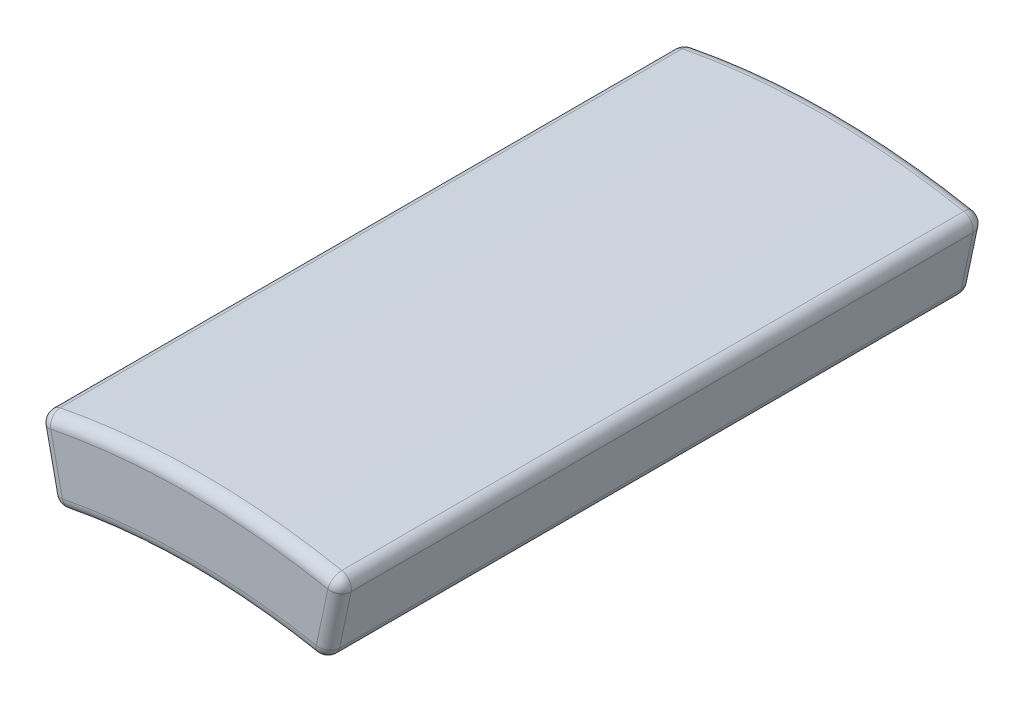
ISO-10303-21;
HEADER;
FILE_DESCRIPTION(('STEP AP214'),'2;1');
FILE_NAME('part.step','',(''),(''),'','','');
FILE_SCHEMA(('AUTOMOTIVE_DESIGN { 1 0 10303 214 1 1 1 1 }'));
ENDSEC;
DATA;
#1=APPLICATION_CONTEXT('core data for automotive mechanical design processes');
#2=APPLICATION_PROTOCOL_DEFINITION('international standard','automotive_design',2000,#1);
#3=PRODUCT_CONTEXT('',#1,'mechanical');
#4=PRODUCT('Part','Part','',(#3));
#5=PRODUCT_RELATED_PRODUCT_CATEGORY('part','',(#4));
#6=PRODUCT_DEFINITION_FORMATION('','',#4);
#7=PRODUCT_DEFINITION_CONTEXT('part definition',#1,'design');
#8=PRODUCT_DEFINITION('design','',#6,#7);
#9=PRODUCT_DEFINITION_SHAPE('','',#8);
#10=(LENGTH_UNIT() NAMED_UNIT(*) SI_UNIT(.MILLI.,.METRE.));
#11=(NAMED_UNIT(*) PLANE_ANGLE_UNIT() SI_UNIT($,.RADIAN.));
#12=(NAMED_UNIT(*) SI_UNIT($,.STERADIAN.) SOLID_ANGLE_UNIT());
#13=UNCERTAINTY_MEASURE_WITH_UNIT(LENGTH_MEASURE(1.E-05),#10,'distance_accuracy_value','');
#14=(GEOMETRIC_REPRESENTATION_CONTEXT(3) GLOBAL_UNCERTAINTY_ASSIGNED_CONTEXT((#13)) GLOBAL_UNIT_ASSIGNED_CONTEXT((#10,
#11,#12)) REPRESENTATION_CONTEXT('',''));
#15=CARTESIAN_POINT('',(0.,0.,0.));
#16=DIRECTION('',(0.,0.,1.));
#17=DIRECTION('',(1.,0.,0.));
#18=AXIS2_PLACEMENT_3D('',#15,#16,#17);
#19=CARTESIAN_POINT('',(0.,-23.65,11.));
#20=DIRECTION('',(0.,0.,-1.));
#21=DIRECTION('',(-1.,0.,0.));
#22=AXIS2_PLACEMENT_3D('',#19,#20,#21);
#23=CYLINDRICAL_SURFACE('',#22,22.3);
#24=DIRECTION('',(0.,0.,-1.));
#25=VECTOR('',#24,1.);
#26=CARTESIAN_POINT('',(4.25134622457351,-1.75899601939636,11.));
#27=LINE('',#26,#25);
#28=CARTESIAN_POINT('',(4.25134622457351,-1.75899601939636,-10.6));
#29=VERTEX_POINT('',#28);
#30=CARTESIAN_POINT('',(4.25134622457351,-1.75899601939636,10.6));
#31=VERTEX_POINT('',#30);
#32=EDGE_CURVE('E140',#29,#31,#27,.F.);
#33=ORIENTED_EDGE('',*,*,#32,.T.);
#34=CARTESIAN_POINT('',(0.,-23.65,10.6));
#35=DIRECTION('',(0.,0.,-1.));
#36=DIRECTION('',(-1.,0.,0.));
#37=AXIS2_PLACEMENT_3D('',#34,#35,#36);
#38=CIRCLE('',#37,22.3);
#39=CARTESIAN_POINT('',(-4.25134622457353,-1.75899601939636,10.6));
#40=VERTEX_POINT('',#39);
#41=EDGE_CURVE('E177',#31,#40,#38,.F.);
#42=ORIENTED_EDGE('',*,*,#41,.T.);
#43=DIRECTION('',(0.,0.,-1.));
#44=VECTOR('',#43,1.);
#45=CARTESIAN_POINT('',(-4.25134622457353,-1.75899601939636,11.));
#46=LINE('',#45,#44);
#47=CARTESIAN_POINT('',(-4.25134622457353,-1.75899601939636,-10.6));
#48=VERTEX_POINT('',#47);
#49=EDGE_CURVE('E174',#40,#48,#46,.T.);
#50=ORIENTED_EDGE('',*,*,#49,.T.);
#51=CARTESIAN_POINT('',(0.,-23.65,-10.6));
#52=DIRECTION('',(0.,0.,-1.));
#53=DIRECTION('',(-1.,0.,0.));
#54=AXIS2_PLACEMENT_3D('',#51,#52,#53);
#55=CIRCLE('',#54,22.3);
#56=EDGE_CURVE('E169',#48,#29,#55,.T.);
#57=ORIENTED_EDGE('',*,*,#56,.T.);
#58=EDGE_LOOP('',(#33,#42,#50,#57));
#59=FACE_BOUND('',#58,.T.);
#60=ADVANCED_FACE('F44',(#59),#23,.F.);
#61=CARTESIAN_POINT('',(4.63643070523595,-1.83730850363612,11.));
#62=DIRECTION('',(-0.978147600733806,0.207911690817756,0.));
#63=DIRECTION('',(-0.207911690817756,-0.978147600733806,0.));
#64=AXIS2_PLACEMENT_3D('',#61,#62,#63);
#65=PLANE('',#64);
#66=DIRECTION('',(0.,0.,-1.));
#67=VECTOR('',#66,1.);
#68=CARTESIAN_POINT('',(5.11395141383963,0.409249799960251,11.));
#69=LINE('',#68,#67);
#70=CARTESIAN_POINT('',(5.11395141383963,0.409249799960251,-10.6));
#71=VERTEX_POINT('',#70);
#72=CARTESIAN_POINT('',(5.11395141383963,0.409249799960251,10.6));
#73=VERTEX_POINT('',#72);
#74=EDGE_CURVE('E162',#71,#73,#69,.F.);
#75=ORIENTED_EDGE('',*,*,#74,.T.);
#76=DIRECTION('',(0.207911690817756,0.978147600733806,0.));
#77=VECTOR('',#76,1.);
#78=CARTESIAN_POINT('',(4.63643070523595,-1.83730850363612,10.6));
#79=LINE('',#78,#77);
#80=CARTESIAN_POINT('',(4.71886259624952,-1.44949694719245,10.6));
#81=VERTEX_POINT('',#80);
#82=EDGE_CURVE('E166',#73,#81,#79,.F.);
#83=ORIENTED_EDGE('',*,*,#82,.T.);
#84=DIRECTION('',(0.,0.,-1.));
#85=VECTOR('',#84,1.);
#86=CARTESIAN_POINT('',(4.71886259624952,-1.44949694719245,11.));
#87=LINE('',#86,#85);
#88=CARTESIAN_POINT('',(4.71886259624952,-1.44949694719245,-10.6));
#89=VERTEX_POINT('',#88);
#90=EDGE_CURVE('E138',#81,#89,#87,.T.);
#91=ORIENTED_EDGE('',*,*,#90,.T.);
#92=DIRECTION('',(0.207911690817756,0.978147600733806,0.));
#93=VECTOR('',#92,1.);
#94=CARTESIAN_POINT('',(5.1977922704439,0.803690018345158,-10.6));
#95=LINE('',#94,#93);
#96=EDGE_CURVE('E156',#89,#71,#95,.T.);
#97=ORIENTED_EDGE('',*,*,#96,.T.);
#98=EDGE_LOOP('',(#75,#83,#91,#97));
#99=FACE_BOUND('',#98,.T.);
#100=ADVANCED_FACE('F164',(#99),#65,.F.);
#101=CARTESIAN_POINT('',(0.,-23.65,11.));
#102=DIRECTION('',(0.,0.,-1.));
#103=DIRECTION('',(-1.,0.,0.));
#104=AXIS2_PLACEMENT_3D('',#101,#102,#103);
#105=CYLINDRICAL_SURFACE('',#104,25.);
#106=DIRECTION('',(0.,0.,-1.));
#107=VECTOR('',#106,1.);
#108=CARTESIAN_POINT('',(-4.79948411945744,0.88497406126764,11.));
#109=LINE('',#108,#107);
#110=CARTESIAN_POINT('',(-4.79948411945744,0.88497406126764,-10.6));
#111=VERTEX_POINT('',#110);
#112=CARTESIAN_POINT('',(-4.79948411945744,0.88497406126764,10.6));
#113=VERTEX_POINT('',#112);
#114=EDGE_CURVE('E181',#111,#113,#109,.F.);
#115=ORIENTED_EDGE('',*,*,#114,.T.);
#116=CARTESIAN_POINT('',(0.,-23.65,10.6));
#117=DIRECTION('',(0.,0.,-1.));
#118=DIRECTION('',(-1.,0.,0.));
#119=AXIS2_PLACEMENT_3D('',#116,#117,#118);
#120=CIRCLE('',#119,25.);
#121=CARTESIAN_POINT('',(4.79948411945743,0.88497406126764,10.6));
#122=VERTEX_POINT('',#121);
#123=EDGE_CURVE('E186',#113,#122,#120,.T.);
#124=ORIENTED_EDGE('',*,*,#123,.T.);
#125=DIRECTION('',(0.,0.,-1.));
#126=VECTOR('',#125,1.);
#127=CARTESIAN_POINT('',(4.79948411945743,0.88497406126764,11.));
#128=LINE('',#127,#126);
#129=CARTESIAN_POINT('',(4.79948411945743,0.88497406126764,-10.6));
#130=VERTEX_POINT('',#129);
#131=EDGE_CURVE('E183',#122,#130,#128,.T.);
#132=ORIENTED_EDGE('',*,*,#131,.T.);
#133=CARTESIAN_POINT('',(0.,-23.65,-10.6));
#134=DIRECTION('',(0.,0.,-1.));
#135=DIRECTION('',(-1.,0.,0.));
#136=AXIS2_PLACEMENT_3D('',#133,#134,#135);
#137=CIRCLE('',#136,25.);
#138=EDGE_CURVE('E179',#130,#111,#137,.F.);
#139=ORIENTED_EDGE('',*,*,#138,.T.);
#140=EDGE_LOOP('',(#115,#124,#132,#139));
#141=FACE_BOUND('',#140,.T.);
#142=ADVANCED_FACE('F291',(#141),#105,.T.);
#143=CARTESIAN_POINT('',(-5.19779227044391,0.803690018345159,11.));
#144=DIRECTION('',(0.978147600733806,0.207911690817756,0.));
#145=DIRECTION('',(-0.207911690817756,0.978147600733806,0.));
#146=AXIS2_PLACEMENT_3D('',#143,#144,#145);
#147=PLANE('',#146);
#148=DIRECTION('',(0.,0.,-1.));
#149=VECTOR('',#148,1.);
#150=CARTESIAN_POINT('',(-4.71886259624953,-1.44949694719245,11.));
#151=LINE('',#150,#149);
#152=CARTESIAN_POINT('',(-4.71886259624953,-1.44949694719245,-10.6));
#153=VERTEX_POINT('',#152);
#154=CARTESIAN_POINT('',(-4.71886259624953,-1.44949694719245,10.6));
#155=VERTEX_POINT('',#154);
#156=EDGE_CURVE('E190',#153,#155,#151,.F.);
#157=ORIENTED_EDGE('',*,*,#156,.T.);
#158=DIRECTION('',(0.207911690817756,-0.978147600733806,0.));
#159=VECTOR('',#158,1.);
#160=CARTESIAN_POINT('',(-5.19779227044391,0.803690018345159,10.6));
#161=LINE('',#160,#159);
#162=CARTESIAN_POINT('',(-5.11395141383964,0.409249799960251,10.6));
#163=VERTEX_POINT('',#162);
#164=EDGE_CURVE('E195',#155,#163,#161,.F.);
#165=ORIENTED_EDGE('',*,*,#164,.T.);
#166=DIRECTION('',(0.,0.,-1.));
#167=VECTOR('',#166,1.);
#168=CARTESIAN_POINT('',(-5.11395141383964,0.409249799960251,11.));
#169=LINE('',#168,#167);
#170=CARTESIAN_POINT('',(-5.11395141383964,0.409249799960251,-10.6));
#171=VERTEX_POINT('',#170);
#172=EDGE_CURVE('E192',#163,#171,#169,.T.);
#173=ORIENTED_EDGE('',*,*,#172,.T.);
#174=DIRECTION('',(0.207911690817756,-0.978147600733806,0.));
#175=VECTOR('',#174,1.);
#176=CARTESIAN_POINT('',(-4.63643070523597,-1.83730850363612,-10.6));
#177=LINE('',#176,#175);
#178=EDGE_CURVE('E188',#171,#153,#177,.T.);
#179=ORIENTED_EDGE('',*,*,#178,.T.);
#180=EDGE_LOOP('',(#157,#165,#173,#179));
#181=FACE_BOUND('',#180,.T.);
#182=ADVANCED_FACE('F302',(#181),#147,.F.);
#183=CARTESIAN_POINT('',(0.,-23.65,11.));
#184=DIRECTION('',(0.,0.,-1.));
#185=DIRECTION('',(-1.,0.,0.));
#186=AXIS2_PLACEMENT_3D('',#183,#184,#185);
#187=PLANE('',#186);
#188=CARTESIAN_POINT('',(0.,-23.65,11.));
#189=DIRECTION('',(0.,0.,-1.));
#190=DIRECTION('',(-1.,0.,0.));
#191=AXIS2_PLACEMENT_3D('',#188,#189,#190);
#192=CIRCLE('',#191,24.6);
#193=CARTESIAN_POINT('',(4.72269237354611,0.492414476287358,11.));
#194=VERTEX_POINT('',#193);
#195=CARTESIAN_POINT('',(-4.72269237354612,0.492414476287358,11.));
#196=VERTEX_POINT('',#195);
#197=EDGE_CURVE('E201',#194,#196,#192,.F.);
#198=ORIENTED_EDGE('',*,*,#197,.T.);
#199=DIRECTION('',(0.207911690817756,-0.978147600733806,0.));
#200=VECTOR('',#199,1.);
#201=CARTESIAN_POINT('',(0.391259040293518,-23.5668353236729,11.));
#202=LINE('',#201,#200);
#203=CARTESIAN_POINT('',(-4.32760355595601,-1.36633227086535,11.));
#204=VERTEX_POINT('',#203);
#205=EDGE_CURVE('E203',#196,#204,#202,.T.);
#206=ORIENTED_EDGE('',*,*,#205,.T.);
#207=CARTESIAN_POINT('',(0.,-23.65,11.));
#208=DIRECTION('',(0.,0.,-1.));
#209=DIRECTION('',(-1.,0.,0.));
#210=AXIS2_PLACEMENT_3D('',#207,#208,#209);
#211=CIRCLE('',#210,22.7);
#212=CARTESIAN_POINT('',(4.32760355595599,-1.36633227086535,11.));
#213=VERTEX_POINT('',#212);
#214=EDGE_CURVE('E197',#204,#213,#211,.T.);
#215=ORIENTED_EDGE('',*,*,#214,.T.);
#216=DIRECTION('',(0.207911690817756,0.978147600733806,0.));
#217=VECTOR('',#216,1.);
#218=CARTESIAN_POINT('',(-0.391259040293533,-23.5668353236729,11.));
#219=LINE('',#218,#217);
#220=EDGE_CURVE('E199',#213,#194,#219,.T.);
#221=ORIENTED_EDGE('',*,*,#220,.T.);
#222=EDGE_LOOP('',(#198,#206,#215,#221));
#223=FACE_BOUND('',#222,.T.);
#224=ADVANCED_FACE('F283',(#223),#187,.F.);
#225=CARTESIAN_POINT('',(0.,-23.65,-11.));
#226=DIRECTION('',(0.,0.,-1.));
#227=DIRECTION('',(-1.,0.,0.));
#228=AXIS2_PLACEMENT_3D('',#225,#226,#227);
#229=PLANE('',#228);
#230=CARTESIAN_POINT('',(0.,-23.65,-11.));
#231=DIRECTION('',(0.,0.,-1.));
#232=DIRECTION('',(-1.,0.,0.));
#233=AXIS2_PLACEMENT_3D('',#230,#231,#232);
#234=CIRCLE('',#233,24.6);
#235=CARTESIAN_POINT('',(-4.72269237354612,0.492414476287358,-11.));
#236=VERTEX_POINT('',#235);
#237=CARTESIAN_POINT('',(4.72269237354611,0.492414476287358,-11.));
#238=VERTEX_POINT('',#237);
#239=EDGE_CURVE('E53',#236,#238,#234,.T.);
#240=ORIENTED_EDGE('',*,*,#239,.T.);
#241=DIRECTION('',(0.207911690817756,0.978147600733806,0.));
#242=VECTOR('',#241,1.);
#243=CARTESIAN_POINT('',(4.24517166494243,-1.75414382730902,-11.));
#244=LINE('',#243,#242);
#245=CARTESIAN_POINT('',(4.32760355595599,-1.36633227086535,-11.));
#246=VERTEX_POINT('',#245);
#247=EDGE_CURVE('E11',#238,#246,#244,.F.);
#248=ORIENTED_EDGE('',*,*,#247,.T.);
#249=CARTESIAN_POINT('',(0.,-23.65,-11.));
#250=DIRECTION('',(0.,0.,-1.));
#251=DIRECTION('',(-1.,0.,0.));
#252=AXIS2_PLACEMENT_3D('',#249,#250,#251);
#253=CIRCLE('',#252,22.7);
#254=CARTESIAN_POINT('',(-4.32760355595601,-1.36633227086535,-11.));
#255=VERTEX_POINT('',#254);
#256=EDGE_CURVE('E206',#246,#255,#253,.F.);
#257=ORIENTED_EDGE('',*,*,#256,.T.);
#258=DIRECTION('',(0.207911690817756,-0.978147600733806,0.));
#259=VECTOR('',#258,1.);
#260=CARTESIAN_POINT('',(-4.80653323015039,0.886854694672261,-11.));
#261=LINE('',#260,#259);
#262=EDGE_CURVE('E64',#255,#236,#261,.F.);
#263=ORIENTED_EDGE('',*,*,#262,.T.);
#264=EDGE_LOOP('',(#240,#248,#257,#263));
#265=FACE_BOUND('',#264,.T.);
#266=ADVANCED_FACE('F428',(#265),#229,.T.);
#267=CARTESIAN_POINT('',(-4.72269237354612,0.492414476287353,11.));
#268=DIRECTION('',(0.,0.,-1.));
#269=DIRECTION('',(-1.,0.,0.));
#270=AXIS2_PLACEMENT_3D('',#267,#268,#269);
#271=CYLINDRICAL_SURFACE('',#270,0.4);
#272=CARTESIAN_POINT('',(-4.72269237354612,0.492414476287358,10.6));
#273=DIRECTION('',(0.,0.,1.));
#274=DIRECTION('',(1.,0.,0.));
#275=AXIS2_PLACEMENT_3D('',#272,#273,#274);
#276=CIRCLE('',#275,0.4);
#277=EDGE_CURVE('E48',#113,#163,#276,.T.);
#278=ORIENTED_EDGE('',*,*,#277,.F.);
#279=ORIENTED_EDGE('',*,*,#114,.F.);
#280=CARTESIAN_POINT('',(-4.72269237354612,0.492414476287353,-10.6));
#281=DIRECTION('',(0.,0.,-1.));
#282=DIRECTION('',(-1.,0.,0.));
#283=AXIS2_PLACEMENT_3D('',#280,#281,#282);
#284=CIRCLE('',#283,0.4);
#285=EDGE_CURVE('E260',#171,#111,#284,.T.);
#286=ORIENTED_EDGE('',*,*,#285,.F.);
#287=ORIENTED_EDGE('',*,*,#172,.F.);
#288=EDGE_LOOP('',(#278,#279,#286,#287));
#289=FACE_BOUND('',#288,.T.);
#290=ADVANCED_FACE('F46',(#289),#271,.T.);
#291=CARTESIAN_POINT('',(-4.72269237354612,0.492414476287357,10.6));
#292=DIRECTION('',(0.,0.,1.));
#293=DIRECTION('',(1.,0.,0.));
#294=AXIS2_PLACEMENT_3D('',#291,#292,#293);
#295=SPHERICAL_SURFACE('',#294,0.4);
#296=CARTESIAN_POINT('',(-4.72269237354612,0.492414476287358,10.6));
#297=DIRECTION('',(-0.981398962450705,-0.191979364778298,0.));
#298=DIRECTION('',(0.191979364778298,-0.981398962450705,0.));
#299=AXIS2_PLACEMENT_3D('',#296,#297,#298);
#300=CIRCLE('',#299,0.4);
#301=EDGE_CURVE('E255',#113,#196,#300,.F.);
#302=ORIENTED_EDGE('',*,*,#301,.F.);
#303=ORIENTED_EDGE('',*,*,#277,.T.);
#304=CARTESIAN_POINT('',(-4.72269237354612,0.492414476287353,10.6));
#305=DIRECTION('',(-0.207911690817756,0.978147600733806,0.));
#306=DIRECTION('',(-0.978147600733806,-0.207911690817756,0.));
#307=AXIS2_PLACEMENT_3D('',#304,#305,#306);
#308=CIRCLE('',#307,0.4);
#309=EDGE_CURVE('E258',#196,#163,#308,.F.);
#310=ORIENTED_EDGE('',*,*,#309,.F.);
#311=EDGE_LOOP('',(#302,#303,#310));
#312=FACE_BOUND('',#311,.T.);
#313=ADVANCED_FACE('F271',(#312),#295,.T.);
#314=CARTESIAN_POINT('',(-4.72269237354612,0.492414476287357,-10.6));
#315=DIRECTION('',(0.,0.,1.));
#316=DIRECTION('',(1.,0.,0.));
#317=AXIS2_PLACEMENT_3D('',#314,#315,#316);
#318=SPHERICAL_SURFACE('',#317,0.4);
#319=CARTESIAN_POINT('',(-4.72269237354612,0.492414476287358,-10.6));
#320=DIRECTION('',(-0.207911690817769,0.978147600733804,0.));
#321=DIRECTION('',(-0.978147600733804,-0.207911690817769,0.));
#322=AXIS2_PLACEMENT_3D('',#319,#320,#321);
#323=CIRCLE('',#322,0.4);
#324=EDGE_CURVE('E250',#171,#236,#323,.F.);
#325=ORIENTED_EDGE('',*,*,#324,.F.);
#326=ORIENTED_EDGE('',*,*,#285,.T.);
#327=CARTESIAN_POINT('',(-4.72269237354612,0.492414476287358,-10.6));
#328=DIRECTION('',(-0.981398962450705,-0.191979364778298,0.));
#329=DIRECTION('',(0.191979364778298,-0.981398962450705,0.));
#330=AXIS2_PLACEMENT_3D('',#327,#328,#329);
#331=CIRCLE('',#330,0.4);
#332=EDGE_CURVE('E252',#236,#111,#331,.F.);
#333=ORIENTED_EDGE('',*,*,#332,.F.);
#334=EDGE_LOOP('',(#325,#326,#333));
#335=FACE_BOUND('',#334,.T.);
#336=ADVANCED_FACE('F374',(#335),#318,.T.);
#337=CARTESIAN_POINT('',(0.391259040293518,-23.5668353236729,10.6));
#338=DIRECTION('',(0.207911690817756,-0.978147600733806,0.));
#339=DIRECTION('',(0.978147600733806,0.207911690817756,0.));
#340=AXIS2_PLACEMENT_3D('',#337,#338,#339);
#341=CYLINDRICAL_SURFACE('',#340,0.4);
#342=ORIENTED_EDGE('',*,*,#309,.T.);
#343=ORIENTED_EDGE('',*,*,#164,.F.);
#344=CARTESIAN_POINT('',(-4.32760355595601,-1.36633227086535,10.6));
#345=DIRECTION('',(0.207911690817747,-0.978147600733808,0.));
#346=DIRECTION('',(0.978147600733809,0.207911690817747,0.));
#347=AXIS2_PLACEMENT_3D('',#344,#345,#346);
#348=CIRCLE('',#347,0.4);
#349=EDGE_CURVE('E244',#204,#155,#348,.T.);
#350=ORIENTED_EDGE('',*,*,#349,.F.);
#351=ORIENTED_EDGE('',*,*,#205,.F.);
#352=EDGE_LOOP('',(#342,#343,#350,#351));
#353=FACE_BOUND('',#352,.T.);
#354=ADVANCED_FACE('F279',(#353),#341,.T.);
#355=CARTESIAN_POINT('',(0.,-23.65,10.6));
#356=DIRECTION('',(0.,0.,-1.));
#357=DIRECTION('',(-1.,0.,0.));
#358=AXIS2_PLACEMENT_3D('',#355,#356,#357);
#359=TOROIDAL_SURFACE('',#358,24.6,0.4);
#360=ORIENTED_EDGE('',*,*,#301,.T.);
#361=ORIENTED_EDGE('',*,*,#197,.F.);
#362=CARTESIAN_POINT('',(4.72269237354611,0.492414476287357,10.6));
#363=DIRECTION('',(0.981398962450705,-0.191979364778298,0.));
#364=DIRECTION('',(0.191979364778298,0.981398962450705,0.));
#365=AXIS2_PLACEMENT_3D('',#362,#363,#364);
#366=CIRCLE('',#365,0.4);
#367=EDGE_CURVE('E241',#122,#194,#366,.T.);
#368=ORIENTED_EDGE('',*,*,#367,.F.);
#369=ORIENTED_EDGE('',*,*,#123,.F.);
#370=EDGE_LOOP('',(#360,#361,#368,#369));
#371=FACE_BOUND('',#370,.T.);
#372=ADVANCED_FACE('F288',(#371),#359,.T.);
#373=CARTESIAN_POINT('',(4.72269237354611,0.492414476287353,11.));
#374=DIRECTION('',(0.,0.,-1.));
#375=DIRECTION('',(-1.,0.,0.));
#376=AXIS2_PLACEMENT_3D('',#373,#374,#375);
#377=CYLINDRICAL_SURFACE('',#376,0.4);
#378=CARTESIAN_POINT('',(4.72269237354611,0.492414476287357,-10.6));
#379=DIRECTION('',(0.,0.,-1.));
#380=DIRECTION('',(-1.,0.,0.));
#381=AXIS2_PLACEMENT_3D('',#378,#379,#380);
#382=CIRCLE('',#381,0.4);
#383=EDGE_CURVE('E235',#130,#71,#382,.T.);
#384=ORIENTED_EDGE('',*,*,#383,.F.);
#385=ORIENTED_EDGE('',*,*,#131,.F.);
#386=CARTESIAN_POINT('',(4.72269237354611,0.492414476287353,10.6));
#387=DIRECTION('',(0.,0.,1.));
#388=DIRECTION('',(1.,0.,0.));
#389=AXIS2_PLACEMENT_3D('',#386,#387,#388);
#390=CIRCLE('',#389,0.4);
#391=EDGE_CURVE('E238',#73,#122,#390,.T.);
#392=ORIENTED_EDGE('',*,*,#391,.F.);
#393=ORIENTED_EDGE('',*,*,#74,.F.);
#394=EDGE_LOOP('',(#384,#385,#392,#393));
#395=FACE_BOUND('',#394,.T.);
#396=ADVANCED_FACE('F295',(#395),#377,.T.);
#397=CARTESIAN_POINT('',(0.,-23.65,-10.6));
#398=DIRECTION('',(0.,0.,-1.));
#399=DIRECTION('',(-1.,0.,0.));
#400=AXIS2_PLACEMENT_3D('',#397,#398,#399);
#401=TOROIDAL_SURFACE('',#400,24.6,0.4);
#402=ORIENTED_EDGE('',*,*,#332,.T.);
#403=ORIENTED_EDGE('',*,*,#138,.F.);
#404=CARTESIAN_POINT('',(4.72269237354611,0.492414476287358,-10.6));
#405=DIRECTION('',(0.981398962450705,-0.191979364778301,0.));
#406=DIRECTION('',(0.191979364778301,0.981398962450705,0.));
#407=AXIS2_PLACEMENT_3D('',#404,#405,#406);
#408=CIRCLE('',#407,0.4);
#409=EDGE_CURVE('E233',#238,#130,#408,.T.);
#410=ORIENTED_EDGE('',*,*,#409,.F.);
#411=ORIENTED_EDGE('',*,*,#239,.F.);
#412=EDGE_LOOP('',(#402,#403,#410,#411));
#413=FACE_BOUND('',#412,.T.);
#414=ADVANCED_FACE('F300',(#413),#401,.T.);
#415=CARTESIAN_POINT('',(-4.80653323015039,0.886854694672261,-10.6));
#416=DIRECTION('',(-0.207911690817756,0.978147600733806,0.));
#417=DIRECTION('',(-0.978147600733806,-0.207911690817756,0.));
#418=AXIS2_PLACEMENT_3D('',#415,#416,#417);
#419=CYLINDRICAL_SURFACE('',#418,0.4);
#420=ORIENTED_EDGE('',*,*,#324,.T.);
#421=ORIENTED_EDGE('',*,*,#262,.F.);
#422=CARTESIAN_POINT('',(-4.32760355595601,-1.36633227086535,-10.6));
#423=DIRECTION('',(0.207911690817756,-0.978147600733806,0.));
#424=DIRECTION('',(0.978147600733806,0.207911690817756,0.));
#425=AXIS2_PLACEMENT_3D('',#422,#423,#424);
#426=CIRCLE('',#425,0.4);
#427=EDGE_CURVE('E230',#153,#255,#426,.T.);
#428=ORIENTED_EDGE('',*,*,#427,.F.);
#429=ORIENTED_EDGE('',*,*,#178,.F.);
#430=EDGE_LOOP('',(#420,#421,#428,#429));
#431=FACE_BOUND('',#430,.T.);
#432=ADVANCED_FACE('F311',(#431),#419,.T.);
#433=CARTESIAN_POINT('',(-4.32760355595601,-1.36633227086535,11.));
#434=DIRECTION('',(0.,0.,-1.));
#435=DIRECTION('',(-1.,0.,0.));
#436=AXIS2_PLACEMENT_3D('',#433,#434,#435);
#437=CYLINDRICAL_SURFACE('',#436,0.4);
#438=CARTESIAN_POINT('',(-4.32760355595601,-1.36633227086535,10.6));
#439=DIRECTION('',(0.,0.,1.));
#440=DIRECTION('',(1.,0.,0.));
#441=AXIS2_PLACEMENT_3D('',#438,#439,#440);
#442=CIRCLE('',#441,0.4);
#443=EDGE_CURVE('E247',#155,#40,#442,.T.);
#444=ORIENTED_EDGE('',*,*,#443,.F.);
#445=ORIENTED_EDGE('',*,*,#156,.F.);
#446=CARTESIAN_POINT('',(-4.32760355595601,-1.36633227086535,-10.6));
#447=DIRECTION('',(0.,0.,-1.));
#448=DIRECTION('',(-1.,0.,0.));
#449=AXIS2_PLACEMENT_3D('',#446,#447,#448);
#450=CIRCLE('',#449,0.4);
#451=EDGE_CURVE('E227',#48,#153,#450,.T.);
#452=ORIENTED_EDGE('',*,*,#451,.F.);
#453=ORIENTED_EDGE('',*,*,#49,.F.);
#454=EDGE_LOOP('',(#444,#445,#452,#453));
#455=FACE_BOUND('',#454,.T.);
#456=ADVANCED_FACE('F307',(#455),#437,.T.);
#457=CARTESIAN_POINT('',(-4.32760355595601,-1.36633227086535,10.6));
#458=DIRECTION('',(0.,0.,1.));
#459=DIRECTION('',(1.,0.,0.));
#460=AXIS2_PLACEMENT_3D('',#457,#458,#459);
#461=SPHERICAL_SURFACE('',#460,0.4);
#462=ORIENTED_EDGE('',*,*,#349,.T.);
#463=ORIENTED_EDGE('',*,*,#443,.T.);
#464=CARTESIAN_POINT('',(-4.32760355595601,-1.36633227086535,10.6));
#465=DIRECTION('',(-0.981659371327518,-0.190643328456211,0.));
#466=DIRECTION('',(0.190643328456211,-0.981659371327518,0.));
#467=AXIS2_PLACEMENT_3D('',#464,#465,#466);
#468=CIRCLE('',#467,0.4);
#469=EDGE_CURVE('E224',#204,#40,#468,.F.);
#470=ORIENTED_EDGE('',*,*,#469,.F.);
#471=EDGE_LOOP('',(#462,#463,#470));
#472=FACE_BOUND('',#471,.T.);
#473=ADVANCED_FACE('F321',(#472),#461,.T.);
#474=CARTESIAN_POINT('',(4.72269237354611,0.492414476287357,10.6));
#475=DIRECTION('',(0.,0.,1.));
#476=DIRECTION('',(1.,0.,0.));
#477=AXIS2_PLACEMENT_3D('',#474,#475,#476);
#478=SPHERICAL_SURFACE('',#477,0.4);
#479=ORIENTED_EDGE('',*,*,#391,.T.);
#480=ORIENTED_EDGE('',*,*,#367,.T.);
#481=CARTESIAN_POINT('',(4.72269237354611,0.492414476287358,10.6));
#482=DIRECTION('',(0.207911690817768,0.978147600733804,0.));
#483=DIRECTION('',(-0.978147600733804,0.207911690817768,0.));
#484=AXIS2_PLACEMENT_3D('',#481,#482,#483);
#485=CIRCLE('',#484,0.4);
#486=EDGE_CURVE('E221',#73,#194,#485,.F.);
#487=ORIENTED_EDGE('',*,*,#486,.F.);
#488=EDGE_LOOP('',(#479,#480,#487));
#489=FACE_BOUND('',#488,.T.);
#490=ADVANCED_FACE('F331',(#489),#478,.T.);
#491=CARTESIAN_POINT('',(4.72269237354611,0.492414476287356,-10.6));
#492=DIRECTION('',(0.,0.,1.));
#493=DIRECTION('',(1.,0.,0.));
#494=AXIS2_PLACEMENT_3D('',#491,#492,#493);
#495=SPHERICAL_SURFACE('',#494,0.4);
#496=ORIENTED_EDGE('',*,*,#409,.T.);
#497=ORIENTED_EDGE('',*,*,#383,.T.);
#498=CARTESIAN_POINT('',(4.72269237354611,0.492414476287353,-10.6));
#499=DIRECTION('',(0.207911690817756,0.978147600733806,0.));
#500=DIRECTION('',(-0.978147600733806,0.207911690817756,0.));
#501=AXIS2_PLACEMENT_3D('',#498,#499,#500);
#502=CIRCLE('',#501,0.4);
#503=EDGE_CURVE('E159',#238,#71,#502,.F.);
#504=ORIENTED_EDGE('',*,*,#503,.F.);
#505=EDGE_LOOP('',(#496,#497,#504));
#506=FACE_BOUND('',#505,.T.);
#507=ADVANCED_FACE('F333',(#506),#495,.T.);
#508=CARTESIAN_POINT('',(-4.32760355595601,-1.36633227086535,-10.6));
#509=DIRECTION('',(0.,0.,1.));
#510=DIRECTION('',(1.,0.,0.));
#511=AXIS2_PLACEMENT_3D('',#508,#509,#510);
#512=SPHERICAL_SURFACE('',#511,0.4);
#513=ORIENTED_EDGE('',*,*,#451,.T.);
#514=ORIENTED_EDGE('',*,*,#427,.T.);
#515=CARTESIAN_POINT('',(-4.32760355595601,-1.36633227086535,-10.6));
#516=DIRECTION('',(-0.981659371327518,-0.19064332845621,0.));
#517=DIRECTION('',(0.19064332845621,-0.981659371327518,0.));
#518=AXIS2_PLACEMENT_3D('',#515,#516,#517);
#519=CIRCLE('',#518,0.4);
#520=EDGE_CURVE('E217',#48,#255,#519,.F.);
#521=ORIENTED_EDGE('',*,*,#520,.F.);
#522=EDGE_LOOP('',(#513,#514,#521));
#523=FACE_BOUND('',#522,.T.);
#524=ADVANCED_FACE('F313',(#523),#512,.T.);
#525=CARTESIAN_POINT('',(0.,-23.65,10.6));
#526=DIRECTION('',(0.,0.,-1.));
#527=DIRECTION('',(-1.,0.,0.));
#528=AXIS2_PLACEMENT_3D('',#525,#526,#527);
#529=TOROIDAL_SURFACE('',#528,22.7,0.4);
#530=ORIENTED_EDGE('',*,*,#469,.T.);
#531=ORIENTED_EDGE('',*,*,#41,.F.);
#532=CARTESIAN_POINT('',(4.32760355595599,-1.36633227086535,10.6));
#533=DIRECTION('',(0.981659371327518,-0.19064332845621,0.));
#534=DIRECTION('',(0.19064332845621,0.981659371327518,0.));
#535=AXIS2_PLACEMENT_3D('',#532,#533,#534);
#536=CIRCLE('',#535,0.4);
#537=EDGE_CURVE('E214',#213,#31,#536,.T.);
#538=ORIENTED_EDGE('',*,*,#537,.F.);
#539=ORIENTED_EDGE('',*,*,#214,.F.);
#540=EDGE_LOOP('',(#530,#531,#538,#539));
#541=FACE_BOUND('',#540,.T.);
#542=ADVANCED_FACE('F323',(#541),#529,.T.);
#543=CARTESIAN_POINT('',(-0.391259040293534,-23.5668353236729,10.6));
#544=DIRECTION('',(0.207911690817756,0.978147600733806,0.));
#545=DIRECTION('',(-0.978147600733806,0.207911690817756,0.));
#546=AXIS2_PLACEMENT_3D('',#543,#544,#545);
#547=CYLINDRICAL_SURFACE('',#546,0.4);
#548=ORIENTED_EDGE('',*,*,#486,.T.);
#549=ORIENTED_EDGE('',*,*,#220,.F.);
#550=CARTESIAN_POINT('',(4.32760355595599,-1.36633227086535,10.6));
#551=DIRECTION('',(-0.207911690817756,-0.978147600733806,0.));
#552=DIRECTION('',(0.978147600733806,-0.207911690817756,0.));
#553=AXIS2_PLACEMENT_3D('',#550,#551,#552);
#554=CIRCLE('',#553,0.4);
#555=EDGE_CURVE('E153',#81,#213,#554,.T.);
#556=ORIENTED_EDGE('',*,*,#555,.F.);
#557=ORIENTED_EDGE('',*,*,#82,.F.);
#558=EDGE_LOOP('',(#548,#549,#556,#557));
#559=FACE_BOUND('',#558,.T.);
#560=ADVANCED_FACE('F329',(#559),#547,.T.);
#561=CARTESIAN_POINT('',(4.24517166494243,-1.75414382730902,-10.6));
#562=DIRECTION('',(-0.207911690817756,-0.978147600733806,0.));
#563=DIRECTION('',(0.978147600733806,-0.207911690817756,0.));
#564=AXIS2_PLACEMENT_3D('',#561,#562,#563);
#565=CYLINDRICAL_SURFACE('',#564,0.4);
#566=ORIENTED_EDGE('',*,*,#503,.T.);
#567=ORIENTED_EDGE('',*,*,#96,.F.);
#568=CARTESIAN_POINT('',(4.32760355595599,-1.36633227086535,-10.6));
#569=DIRECTION('',(-0.207911690817747,-0.978147600733808,0.));
#570=DIRECTION('',(0.978147600733809,-0.207911690817747,0.));
#571=AXIS2_PLACEMENT_3D('',#568,#569,#570);
#572=CIRCLE('',#571,0.4);
#573=EDGE_CURVE('E145',#246,#89,#572,.T.);
#574=ORIENTED_EDGE('',*,*,#573,.F.);
#575=ORIENTED_EDGE('',*,*,#247,.F.);
#576=EDGE_LOOP('',(#566,#567,#574,#575));
#577=FACE_BOUND('',#576,.T.);
#578=ADVANCED_FACE('F157',(#577),#565,.T.);
#579=CARTESIAN_POINT('',(0.,-23.65,-10.6));
#580=DIRECTION('',(0.,0.,-1.));
#581=DIRECTION('',(-1.,0.,0.));
#582=AXIS2_PLACEMENT_3D('',#579,#580,#581);
#583=TOROIDAL_SURFACE('',#582,22.7,0.4);
#584=ORIENTED_EDGE('',*,*,#520,.T.);
#585=ORIENTED_EDGE('',*,*,#256,.F.);
#586=CARTESIAN_POINT('',(4.32760355595599,-1.36633227086535,-10.6));
#587=DIRECTION('',(0.981659371327518,-0.190643328456211,0.));
#588=DIRECTION('',(0.190643328456211,0.981659371327518,0.));
#589=AXIS2_PLACEMENT_3D('',#586,#587,#588);
#590=CIRCLE('',#589,0.4);
#591=EDGE_CURVE('E149',#29,#246,#590,.T.);
#592=ORIENTED_EDGE('',*,*,#591,.F.);
#593=ORIENTED_EDGE('',*,*,#56,.F.);
#594=EDGE_LOOP('',(#584,#585,#592,#593));
#595=FACE_BOUND('',#594,.T.);
#596=ADVANCED_FACE('F316',(#595),#583,.T.);
#597=CARTESIAN_POINT('',(4.32760355595599,-1.36633227086535,10.6));
#598=DIRECTION('',(0.,0.,1.));
#599=DIRECTION('',(1.,0.,0.));
#600=AXIS2_PLACEMENT_3D('',#597,#598,#599);
#601=SPHERICAL_SURFACE('',#600,0.4);
#602=ORIENTED_EDGE('',*,*,#555,.T.);
#603=ORIENTED_EDGE('',*,*,#537,.T.);
#604=CARTESIAN_POINT('',(4.32760355595599,-1.36633227086535,10.6));
#605=DIRECTION('',(0.,0.,1.));
#606=DIRECTION('',(1.,0.,0.));
#607=AXIS2_PLACEMENT_3D('',#604,#605,#606);
#608=CIRCLE('',#607,0.4);
#609=EDGE_CURVE('E142',#81,#31,#608,.F.);
#610=ORIENTED_EDGE('',*,*,#609,.F.);
#611=EDGE_LOOP('',(#602,#603,#610));
#612=FACE_BOUND('',#611,.T.);
#613=ADVANCED_FACE('F327',(#612),#601,.T.);
#614=CARTESIAN_POINT('',(4.32760355595599,-1.36633227086535,-10.6));
#615=DIRECTION('',(0.,0.,1.));
#616=DIRECTION('',(1.,0.,0.));
#617=AXIS2_PLACEMENT_3D('',#614,#615,#616);
#618=SPHERICAL_SURFACE('',#617,0.4);
#619=ORIENTED_EDGE('',*,*,#591,.T.);
#620=ORIENTED_EDGE('',*,*,#573,.T.);
#621=CARTESIAN_POINT('',(4.32760355595599,-1.36633227086535,-10.6));
#622=DIRECTION('',(0.,0.,-1.));
#623=DIRECTION('',(-1.,0.,0.));
#624=AXIS2_PLACEMENT_3D('',#621,#622,#623);
#625=CIRCLE('',#624,0.4);
#626=EDGE_CURVE('E134',#29,#89,#625,.F.);
#627=ORIENTED_EDGE('',*,*,#626,.F.);
#628=EDGE_LOOP('',(#619,#620,#627));
#629=FACE_BOUND('',#628,.T.);
#630=ADVANCED_FACE('F147',(#629),#618,.T.);
#631=CARTESIAN_POINT('',(4.32760355595599,-1.36633227086535,11.));
#632=DIRECTION('',(0.,0.,-1.));
#633=DIRECTION('',(-1.,0.,0.));
#634=AXIS2_PLACEMENT_3D('',#631,#632,#633);
#635=CYLINDRICAL_SURFACE('',#634,0.4);
#636=ORIENTED_EDGE('',*,*,#609,.T.);
#637=ORIENTED_EDGE('',*,*,#32,.F.);
#638=ORIENTED_EDGE('',*,*,#626,.T.);
#639=ORIENTED_EDGE('',*,*,#90,.F.);
#640=EDGE_LOOP('',(#636,#637,#638,#639));
#641=FACE_BOUND('',#640,.T.);
#642=ADVANCED_FACE('F136',(#641),#635,.T.);
#643=CLOSED_SHELL('',(#60,#100,#142,#182,#224,#266,#290,#313,#336,#354,#372,#396,#414,#432,#456,
#473,#490,#507,#524,#542,#560,#578,#596,#613,#630,#642));
#644=MANIFOLD_SOLID_BREP('B2',#643);
#645=ADVANCED_BREP_SHAPE_REPRESENTATION('',(#18,#644),#14);
#646=SHAPE_DEFINITION_REPRESENTATION(#9,#645);
ENDSEC;
END-ISO-10303-21;
